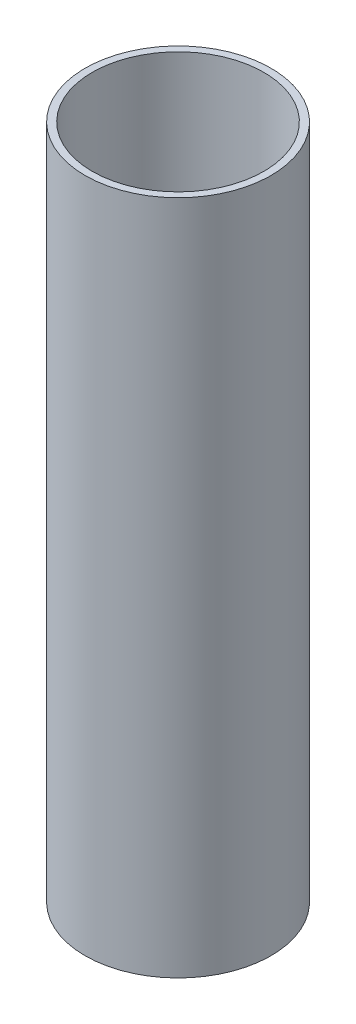
ISO-10303-21;
HEADER;
FILE_DESCRIPTION(('STEP AP214'),'2;1');
FILE_NAME('part.step','',(''),(''),'','','');
FILE_SCHEMA(('AUTOMOTIVE_DESIGN { 1 0 10303 214 1 1 1 1 }'));
ENDSEC;
DATA;
#1=APPLICATION_CONTEXT('core data for automotive mechanical design processes');
#2=APPLICATION_PROTOCOL_DEFINITION('international standard','automotive_design',2000,#1);
#3=PRODUCT_CONTEXT('',#1,'mechanical');
#4=PRODUCT('Part','Part','',(#3));
#5=PRODUCT_RELATED_PRODUCT_CATEGORY('part','',(#4));
#6=PRODUCT_DEFINITION_FORMATION('','',#4);
#7=PRODUCT_DEFINITION_CONTEXT('part definition',#1,'design');
#8=PRODUCT_DEFINITION('design','',#6,#7);
#9=PRODUCT_DEFINITION_SHAPE('','',#8);
#10=(LENGTH_UNIT() NAMED_UNIT(*) SI_UNIT(.MILLI.,.METRE.));
#11=(NAMED_UNIT(*) PLANE_ANGLE_UNIT() SI_UNIT($,.RADIAN.));
#12=(NAMED_UNIT(*) SI_UNIT($,.STERADIAN.) SOLID_ANGLE_UNIT());
#13=UNCERTAINTY_MEASURE_WITH_UNIT(LENGTH_MEASURE(1.E-05),#10,'distance_accuracy_value','');
#14=(GEOMETRIC_REPRESENTATION_CONTEXT(3) GLOBAL_UNCERTAINTY_ASSIGNED_CONTEXT((#13)) GLOBAL_UNIT_ASSIGNED_CONTEXT((#10,
#11,#12)) REPRESENTATION_CONTEXT('',''));
#15=CARTESIAN_POINT('',(0.,0.,0.));
#16=DIRECTION('',(0.,0.,1.));
#17=DIRECTION('',(1.,0.,0.));
#18=AXIS2_PLACEMENT_3D('',#15,#16,#17);
#19=CARTESIAN_POINT('',(0.,300.,0.));
#20=DIRECTION('',(0.,1.,0.));
#21=DIRECTION('',(0.,0.,1.));
#22=AXIS2_PLACEMENT_3D('',#19,#20,#21);
#23=PLANE('',#22);
#24=CARTESIAN_POINT('',(0.,300.,0.));
#25=DIRECTION('',(0.,1.,0.));
#26=DIRECTION('',(0.,0.,1.));
#27=AXIS2_PLACEMENT_3D('',#24,#25,#26);
#28=CIRCLE('',#27,41.275);
#29=CARTESIAN_POINT('',(0.,300.,41.275));
#30=VERTEX_POINT('',#29);
#31=EDGE_CURVE('E10',#30,#30,#28,.T.);
#32=ORIENTED_EDGE('',*,*,#31,.T.);
#33=EDGE_LOOP('',(#32));
#34=FACE_BOUND('',#33,.T.);
#35=CARTESIAN_POINT('',(0.,300.,0.));
#36=DIRECTION('',(0.,1.,0.));
#37=DIRECTION('',(0.,0.,1.));
#38=AXIS2_PLACEMENT_3D('',#35,#36,#37);
#39=CIRCLE('',#38,38.1);
#40=CARTESIAN_POINT('',(0.,300.,38.1));
#41=VERTEX_POINT('',#40);
#42=EDGE_CURVE('E50',#41,#41,#39,.T.);
#43=ORIENTED_EDGE('',*,*,#42,.F.);
#44=EDGE_LOOP('',(#43));
#45=FACE_BOUND('',#44,.T.);
#46=ADVANCED_FACE('F39',(#34,#45),#23,.T.);
#47=CARTESIAN_POINT('',(0.,0.,0.));
#48=DIRECTION('',(0.,1.,0.));
#49=DIRECTION('',(0.,0.,1.));
#50=AXIS2_PLACEMENT_3D('',#47,#48,#49);
#51=PLANE('',#50);
#52=CARTESIAN_POINT('',(0.,0.,0.));
#53=DIRECTION('',(0.,1.,0.));
#54=DIRECTION('',(0.,0.,1.));
#55=AXIS2_PLACEMENT_3D('',#52,#53,#54);
#56=CIRCLE('',#55,41.275);
#57=CARTESIAN_POINT('',(0.,0.,41.275));
#58=VERTEX_POINT('',#57);
#59=EDGE_CURVE('E43',#58,#58,#56,.T.);
#60=ORIENTED_EDGE('',*,*,#59,.F.);
#61=EDGE_LOOP('',(#60));
#62=FACE_BOUND('',#61,.T.);
#63=CARTESIAN_POINT('',(0.,0.,0.));
#64=DIRECTION('',(0.,1.,0.));
#65=DIRECTION('',(0.,0.,1.));
#66=AXIS2_PLACEMENT_3D('',#63,#64,#65);
#67=CIRCLE('',#66,38.1);
#68=CARTESIAN_POINT('',(0.,0.,38.1));
#69=VERTEX_POINT('',#68);
#70=EDGE_CURVE('E52',#69,#69,#67,.T.);
#71=ORIENTED_EDGE('',*,*,#70,.T.);
#72=EDGE_LOOP('',(#71));
#73=FACE_BOUND('',#72,.T.);
#74=ADVANCED_FACE('F62',(#62,#73),#51,.F.);
#75=CARTESIAN_POINT('',(0.,300.,0.));
#76=DIRECTION('',(0.,-1.,0.));
#77=DIRECTION('',(0.,0.,-1.));
#78=AXIS2_PLACEMENT_3D('',#75,#76,#77);
#79=CYLINDRICAL_SURFACE('',#78,41.275);
#80=ORIENTED_EDGE('',*,*,#31,.F.);
#81=EDGE_LOOP('',(#80));
#82=FACE_BOUND('',#81,.T.);
#83=ORIENTED_EDGE('',*,*,#59,.T.);
#84=EDGE_LOOP('',(#83));
#85=FACE_BOUND('',#84,.T.);
#86=ADVANCED_FACE('F41',(#82,#85),#79,.T.);
#87=CARTESIAN_POINT('',(0.,300.,0.));
#88=DIRECTION('',(0.,-1.,0.));
#89=DIRECTION('',(0.,0.,-1.));
#90=AXIS2_PLACEMENT_3D('',#87,#88,#89);
#91=CYLINDRICAL_SURFACE('',#90,38.1);
#92=ORIENTED_EDGE('',*,*,#42,.T.);
#93=EDGE_LOOP('',(#92));
#94=FACE_BOUND('',#93,.T.);
#95=ORIENTED_EDGE('',*,*,#70,.F.);
#96=EDGE_LOOP('',(#95));
#97=FACE_BOUND('',#96,.T.);
#98=ADVANCED_FACE('F58',(#94,#97),#91,.F.);
#99=CLOSED_SHELL('',(#46,#74,#86,#98));
#100=MANIFOLD_SOLID_BREP('B2',#99);
#101=ADVANCED_BREP_SHAPE_REPRESENTATION('',(#18,#100),#14);
#102=SHAPE_DEFINITION_REPRESENTATION(#9,#101);
ENDSEC;
END-ISO-10303-21;
